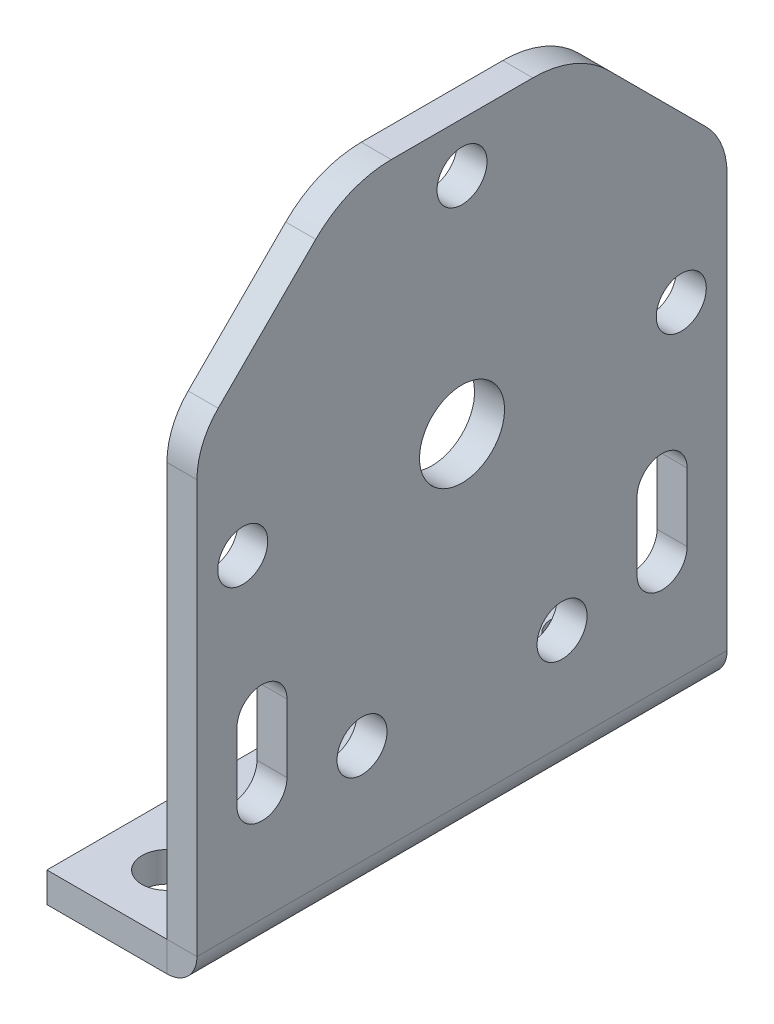
ISO-10303-21;
HEADER;
FILE_DESCRIPTION(('STEP AP214'),'2;1');
FILE_NAME('part.step','',(''),(''),'','','');
FILE_SCHEMA(('AUTOMOTIVE_DESIGN { 1 0 10303 214 1 1 1 1 }'));
ENDSEC;
DATA;
#1=APPLICATION_CONTEXT('core data for automotive mechanical design processes');
#2=APPLICATION_PROTOCOL_DEFINITION('international standard','automotive_design',2000,#1);
#3=PRODUCT_CONTEXT('',#1,'mechanical');
#4=PRODUCT('Part','Part','',(#3));
#5=PRODUCT_RELATED_PRODUCT_CATEGORY('part','',(#4));
#6=PRODUCT_DEFINITION_FORMATION('','',#4);
#7=PRODUCT_DEFINITION_CONTEXT('part definition',#1,'design');
#8=PRODUCT_DEFINITION('design','',#6,#7);
#9=PRODUCT_DEFINITION_SHAPE('','',#8);
#10=(LENGTH_UNIT() NAMED_UNIT(*) SI_UNIT(.MILLI.,.METRE.));
#11=(NAMED_UNIT(*) PLANE_ANGLE_UNIT() SI_UNIT($,.RADIAN.));
#12=(NAMED_UNIT(*) SI_UNIT($,.STERADIAN.) SOLID_ANGLE_UNIT());
#13=UNCERTAINTY_MEASURE_WITH_UNIT(LENGTH_MEASURE(1.E-05),#10,'distance_accuracy_value','');
#14=(GEOMETRIC_REPRESENTATION_CONTEXT(3) GLOBAL_UNCERTAINTY_ASSIGNED_CONTEXT((#13)) GLOBAL_UNIT_ASSIGNED_CONTEXT((#10,
#11,#12)) REPRESENTATION_CONTEXT('',''));
#15=CARTESIAN_POINT('',(0.,0.,0.));
#16=DIRECTION('',(0.,0.,1.));
#17=DIRECTION('',(1.,0.,0.));
#18=AXIS2_PLACEMENT_3D('',#15,#16,#17);
#19=CARTESIAN_POINT('',(12.,0.,0.));
#20=DIRECTION('',(0.,0.,-1.));
#21=DIRECTION('',(-1.,0.,0.));
#22=AXIS2_PLACEMENT_3D('',#19,#20,#21);
#23=PLANE('',#22);
#24=DIRECTION('',(0.,1.,0.));
#25=VECTOR('',#24,1.);
#26=CARTESIAN_POINT('',(12.,0.,0.));
#27=LINE('',#26,#25);
#28=CARTESIAN_POINT('',(12.,0.,0.));
#29=VERTEX_POINT('',#28);
#30=CARTESIAN_POINT('',(12.,41.2869516727951,0.));
#31=VERTEX_POINT('',#30);
#32=EDGE_CURVE('E324',#29,#31,#27,.T.);
#33=ORIENTED_EDGE('',*,*,#32,.T.);
#34=DIRECTION('',(-1.,0.,0.));
#35=VECTOR('',#34,1.);
#36=CARTESIAN_POINT('',(12.,41.2869516727951,0.));
#37=LINE('',#36,#35);
#38=CARTESIAN_POINT('',(15.,41.2869516727951,0.));
#39=VERTEX_POINT('',#38);
#40=EDGE_CURVE('E399',#31,#39,#37,.F.);
#41=ORIENTED_EDGE('',*,*,#40,.T.);
#42=DIRECTION('',(0.,1.,0.));
#43=VECTOR('',#42,1.);
#44=CARTESIAN_POINT('',(15.,0.,0.));
#45=LINE('',#44,#43);
#46=CARTESIAN_POINT('',(15.,0.,0.));
#47=VERTEX_POINT('',#46);
#48=EDGE_CURVE('E305',#47,#39,#45,.T.);
#49=ORIENTED_EDGE('',*,*,#48,.F.);
#50=DIRECTION('',(1.,0.,0.));
#51=VECTOR('',#50,1.);
#52=CARTESIAN_POINT('',(12.,0.,0.));
#53=LINE('',#52,#51);
#54=EDGE_CURVE('E365',#29,#47,#53,.T.);
#55=ORIENTED_EDGE('',*,*,#54,.F.);
#56=EDGE_LOOP('',(#33,#41,#49,#55));
#57=FACE_BOUND('',#56,.T.);
#58=ADVANCED_FACE('F42',(#57),#23,.T.);
#59=CARTESIAN_POINT('',(12.,0.,0.));
#60=DIRECTION('',(0.,0.,-1.));
#61=DIRECTION('',(-1.,0.,0.));
#62=AXIS2_PLACEMENT_3D('',#59,#60,#61);
#63=PLANE('',#62);
#64=DIRECTION('',(0.,-1.,0.));
#65=VECTOR('',#64,1.);
#66=CARTESIAN_POINT('',(12.,0.,0.));
#67=LINE('',#66,#65);
#68=CARTESIAN_POINT('',(12.,-3.,0.));
#69=VERTEX_POINT('',#68);
#70=EDGE_CURVE('E363',#29,#69,#67,.T.);
#71=ORIENTED_EDGE('',*,*,#70,.F.);
#72=ORIENTED_EDGE('',*,*,#54,.T.);
#73=CARTESIAN_POINT('',(12.,0.,0.));
#74=DIRECTION('',(0.,0.,-1.));
#75=DIRECTION('',(-1.,0.,0.));
#76=AXIS2_PLACEMENT_3D('',#73,#74,#75);
#77=CIRCLE('',#76,3.);
#78=EDGE_CURVE('E350',#47,#69,#77,.T.);
#79=ORIENTED_EDGE('',*,*,#78,.T.);
#80=EDGE_LOOP('',(#71,#72,#79));
#81=FACE_BOUND('',#80,.T.);
#82=ADVANCED_FACE('F472',(#81),#63,.T.);
#83=CARTESIAN_POINT('',(12.,0.,53.));
#84=DIRECTION('',(0.,0.,1.));
#85=DIRECTION('',(1.,0.,0.));
#86=AXIS2_PLACEMENT_3D('',#83,#84,#85);
#87=PLANE('',#86);
#88=DIRECTION('',(0.,-1.,0.));
#89=VECTOR('',#88,1.);
#90=CARTESIAN_POINT('',(12.,0.,53.));
#91=LINE('',#90,#89);
#92=CARTESIAN_POINT('',(12.,0.,53.));
#93=VERTEX_POINT('',#92);
#94=CARTESIAN_POINT('',(12.,-3.,53.));
#95=VERTEX_POINT('',#94);
#96=EDGE_CURVE('E361',#93,#95,#91,.T.);
#97=ORIENTED_EDGE('',*,*,#96,.F.);
#98=DIRECTION('',(1.,0.,0.));
#99=VECTOR('',#98,1.);
#100=CARTESIAN_POINT('',(0.,0.,53.));
#101=LINE('',#100,#99);
#102=CARTESIAN_POINT('',(0.,0.,53.));
#103=VERTEX_POINT('',#102);
#104=EDGE_CURVE('E312',#103,#93,#101,.T.);
#105=ORIENTED_EDGE('',*,*,#104,.F.);
#106=DIRECTION('',(0.,1.,0.));
#107=VECTOR('',#106,1.);
#108=CARTESIAN_POINT('',(0.,-3.,53.));
#109=LINE('',#108,#107);
#110=CARTESIAN_POINT('',(0.,-3.,53.));
#111=VERTEX_POINT('',#110);
#112=EDGE_CURVE('E315',#111,#103,#109,.T.);
#113=ORIENTED_EDGE('',*,*,#112,.F.);
#114=DIRECTION('',(1.,0.,0.));
#115=VECTOR('',#114,1.);
#116=CARTESIAN_POINT('',(0.,-3.,53.));
#117=LINE('',#116,#115);
#118=EDGE_CURVE('E318',#111,#95,#117,.T.);
#119=ORIENTED_EDGE('',*,*,#118,.T.);
#120=EDGE_LOOP('',(#97,#105,#113,#119));
#121=FACE_BOUND('',#120,.T.);
#122=ADVANCED_FACE('F424',(#121),#87,.T.);
#123=CARTESIAN_POINT('',(12.,0.,53.));
#124=DIRECTION('',(0.,0.,1.));
#125=DIRECTION('',(1.,0.,0.));
#126=AXIS2_PLACEMENT_3D('',#123,#124,#125);
#127=PLANE('',#126);
#128=DIRECTION('',(1.,0.,0.));
#129=VECTOR('',#128,1.);
#130=CARTESIAN_POINT('',(12.,0.,53.));
#131=LINE('',#130,#129);
#132=CARTESIAN_POINT('',(15.,0.,53.));
#133=VERTEX_POINT('',#132);
#134=EDGE_CURVE('E359',#93,#133,#131,.T.);
#135=ORIENTED_EDGE('',*,*,#134,.F.);
#136=ORIENTED_EDGE('',*,*,#96,.T.);
#137=CARTESIAN_POINT('',(12.,0.,53.));
#138=DIRECTION('',(0.,0.,-1.));
#139=DIRECTION('',(-1.,0.,0.));
#140=AXIS2_PLACEMENT_3D('',#137,#138,#139);
#141=CIRCLE('',#140,3.);
#142=EDGE_CURVE('E356',#95,#133,#141,.F.);
#143=ORIENTED_EDGE('',*,*,#142,.T.);
#144=EDGE_LOOP('',(#135,#136,#143));
#145=FACE_BOUND('',#144,.T.);
#146=ADVANCED_FACE('F440',(#145),#127,.T.);
#147=CARTESIAN_POINT('',(15.,0.,53.));
#148=DIRECTION('',(-1.,0.,0.));
#149=DIRECTION('',(0.,0.,1.));
#150=AXIS2_PLACEMENT_3D('',#147,#148,#149);
#151=PLANE('',#150);
#152=DIRECTION('',(0.,1.,0.));
#153=VECTOR('',#152,1.);
#154=CARTESIAN_POINT('',(15.,11.,49.));
#155=LINE('',#154,#153);
#156=CARTESIAN_POINT('',(15.,11.,49.));
#157=VERTEX_POINT('',#156);
#158=CARTESIAN_POINT('',(15.,17.8,49.));
#159=VERTEX_POINT('',#158);
#160=EDGE_CURVE('E196',#157,#159,#155,.T.);
#161=ORIENTED_EDGE('',*,*,#160,.T.);
#162=CARTESIAN_POINT('',(15.,17.8,46.5));
#163=DIRECTION('',(-1.,0.,0.));
#164=DIRECTION('',(0.,0.,1.));
#165=AXIS2_PLACEMENT_3D('',#162,#163,#164);
#166=CIRCLE('',#165,2.50000000000001);
#167=CARTESIAN_POINT('',(15.,17.8,44.));
#168=VERTEX_POINT('',#167);
#169=EDGE_CURVE('E188',#159,#168,#166,.T.);
#170=ORIENTED_EDGE('',*,*,#169,.T.);
#171=DIRECTION('',(0.,-1.,0.));
#172=VECTOR('',#171,1.);
#173=CARTESIAN_POINT('',(15.,17.8,44.));
#174=LINE('',#173,#172);
#175=CARTESIAN_POINT('',(15.,11.,44.));
#176=VERTEX_POINT('',#175);
#177=EDGE_CURVE('E200',#168,#176,#174,.T.);
#178=ORIENTED_EDGE('',*,*,#177,.T.);
#179=CARTESIAN_POINT('',(15.,11.,46.5));
#180=DIRECTION('',(-1.,0.,0.));
#181=DIRECTION('',(0.,0.,1.));
#182=AXIS2_PLACEMENT_3D('',#179,#180,#181);
#183=CIRCLE('',#182,2.5);
#184=EDGE_CURVE('E204',#176,#157,#183,.T.);
#185=ORIENTED_EDGE('',*,*,#184,.T.);
#186=EDGE_LOOP('',(#161,#170,#178,#185));
#187=FACE_BOUND('',#186,.T.);
#188=DIRECTION('',(0.,1.,0.));
#189=VECTOR('',#188,1.);
#190=CARTESIAN_POINT('',(15.,17.8,9.));
#191=LINE('',#190,#189);
#192=CARTESIAN_POINT('',(15.,11.,9.));
#193=VERTEX_POINT('',#192);
#194=CARTESIAN_POINT('',(15.,17.8,9.));
#195=VERTEX_POINT('',#194);
#196=EDGE_CURVE('E239',#193,#195,#191,.T.);
#197=ORIENTED_EDGE('',*,*,#196,.T.);
#198=CARTESIAN_POINT('',(15.,17.8,6.5));
#199=DIRECTION('',(-1.,0.,0.));
#200=DIRECTION('',(0.,0.,-1.));
#201=AXIS2_PLACEMENT_3D('',#198,#199,#200);
#202=CIRCLE('',#201,2.50000000000001);
#203=CARTESIAN_POINT('',(15.,17.8,3.99999999999999));
#204=VERTEX_POINT('',#203);
#205=EDGE_CURVE('E229',#195,#204,#202,.T.);
#206=ORIENTED_EDGE('',*,*,#205,.T.);
#207=DIRECTION('',(0.,-1.,0.));
#208=VECTOR('',#207,1.);
#209=CARTESIAN_POINT('',(15.,11.,4.));
#210=LINE('',#209,#208);
#211=CARTESIAN_POINT('',(15.,11.,4.));
#212=VERTEX_POINT('',#211);
#213=EDGE_CURVE('E232',#204,#212,#210,.T.);
#214=ORIENTED_EDGE('',*,*,#213,.T.);
#215=CARTESIAN_POINT('',(15.,11.,6.5));
#216=DIRECTION('',(-1.,0.,0.));
#217=DIRECTION('',(0.,0.,-1.));
#218=AXIS2_PLACEMENT_3D('',#215,#216,#217);
#219=CIRCLE('',#218,2.5);
#220=EDGE_CURVE('E236',#212,#193,#219,.T.);
#221=ORIENTED_EDGE('',*,*,#220,.T.);
#222=EDGE_LOOP('',(#197,#206,#214,#221));
#223=FACE_BOUND('',#222,.T.);
#224=CARTESIAN_POINT('',(15.,32.,26.5));
#225=DIRECTION('',(-1.,0.,0.));
#226=DIRECTION('',(0.,0.,1.));
#227=AXIS2_PLACEMENT_3D('',#224,#225,#226);
#228=CIRCLE('',#227,4.25000000000001);
#229=CARTESIAN_POINT('',(15.,32.,30.75));
#230=VERTEX_POINT('',#229);
#231=EDGE_CURVE('E246',#230,#230,#228,.T.);
#232=ORIENTED_EDGE('',*,*,#231,.T.);
#233=EDGE_LOOP('',(#232));
#234=FACE_BOUND('',#233,.T.);
#235=CARTESIAN_POINT('',(15.,54.35,26.5));
#236=DIRECTION('',(1.,0.,0.));
#237=DIRECTION('',(0.,0.,-1.));
#238=AXIS2_PLACEMENT_3D('',#235,#236,#237);
#239=CIRCLE('',#238,2.5);
#240=CARTESIAN_POINT('',(15.,54.35,24.));
#241=VERTEX_POINT('',#240);
#242=EDGE_CURVE('E275',#241,#241,#239,.T.);
#243=ORIENTED_EDGE('',*,*,#242,.F.);
#244=EDGE_LOOP('',(#243));
#245=FACE_BOUND('',#244,.T.);
#246=CARTESIAN_POINT('',(15.,32.43,48.42));
#247=DIRECTION('',(1.,0.,0.));
#248=DIRECTION('',(0.,0.,-1.));
#249=AXIS2_PLACEMENT_3D('',#246,#247,#248);
#250=CIRCLE('',#249,2.5);
#251=CARTESIAN_POINT('',(15.,32.43,45.92));
#252=VERTEX_POINT('',#251);
#253=EDGE_CURVE('E281',#252,#252,#250,.T.);
#254=ORIENTED_EDGE('',*,*,#253,.F.);
#255=EDGE_LOOP('',(#254));
#256=FACE_BOUND('',#255,.T.);
#257=CARTESIAN_POINT('',(15.,32.43,4.57999999999999));
#258=DIRECTION('',(1.,0.,0.));
#259=DIRECTION('',(0.,0.,-1.));
#260=AXIS2_PLACEMENT_3D('',#257,#258,#259);
#261=CIRCLE('',#260,2.5);
#262=CARTESIAN_POINT('',(15.,32.43,2.07999999999999));
#263=VERTEX_POINT('',#262);
#264=EDGE_CURVE('E287',#263,#263,#261,.T.);
#265=ORIENTED_EDGE('',*,*,#264,.F.);
#266=EDGE_LOOP('',(#265));
#267=FACE_BOUND('',#266,.T.);
#268=CARTESIAN_POINT('',(15.,10.,36.5));
#269=DIRECTION('',(1.,0.,0.));
#270=DIRECTION('',(0.,0.,-1.));
#271=AXIS2_PLACEMENT_3D('',#268,#269,#270);
#272=CIRCLE('',#271,2.5);
#273=CARTESIAN_POINT('',(15.,10.,34.));
#274=VERTEX_POINT('',#273);
#275=EDGE_CURVE('E293',#274,#274,#272,.T.);
#276=ORIENTED_EDGE('',*,*,#275,.F.);
#277=EDGE_LOOP('',(#276));
#278=FACE_BOUND('',#277,.T.);
#279=CARTESIAN_POINT('',(15.,10.,16.5));
#280=DIRECTION('',(1.,0.,0.));
#281=DIRECTION('',(0.,0.,-1.));
#282=AXIS2_PLACEMENT_3D('',#279,#280,#281);
#283=CIRCLE('',#282,2.5);
#284=CARTESIAN_POINT('',(15.,10.,14.));
#285=VERTEX_POINT('',#284);
#286=EDGE_CURVE('E299',#285,#285,#283,.T.);
#287=ORIENTED_EDGE('',*,*,#286,.F.);
#288=EDGE_LOOP('',(#287));
#289=FACE_BOUND('',#288,.T.);
#290=ORIENTED_EDGE('',*,*,#48,.T.);
#291=CARTESIAN_POINT('',(15.,41.2869516727951,7.25));
#292=DIRECTION('',(-1.,0.,0.));
#293=DIRECTION('',(0.,0.,1.));
#294=AXIS2_PLACEMENT_3D('',#291,#292,#293);
#295=CIRCLE('',#294,7.25);
#296=CARTESIAN_POINT('',(15.,46.4134758363975,2.12347583639754));
#297=VERTEX_POINT('',#296);
#298=EDGE_CURVE('E404',#39,#297,#295,.F.);
#299=ORIENTED_EDGE('',*,*,#298,.T.);
#300=DIRECTION('',(0.,-0.707106781186546,-0.707106781186549));
#301=VECTOR('',#300,1.);
#302=CARTESIAN_POINT('',(15.,44.29,0.));
#303=LINE('',#302,#301);
#304=CARTESIAN_POINT('',(15.,56.1619004230723,11.8719004230724));
#305=VERTEX_POINT('',#304);
#306=EDGE_CURVE('E367',#297,#305,#303,.F.);
#307=ORIENTED_EDGE('',*,*,#306,.T.);
#308=CARTESIAN_POINT('',(15.,48.61,19.4238008461447));
#309=DIRECTION('',(-1.,0.,0.));
#310=DIRECTION('',(0.,0.,1.));
#311=AXIS2_PLACEMENT_3D('',#308,#309,#310);
#312=CIRCLE('',#311,10.68);
#313=CARTESIAN_POINT('',(15.,59.29,19.4238008461447));
#314=VERTEX_POINT('',#313);
#315=EDGE_CURVE('E394',#305,#314,#312,.F.);
#316=ORIENTED_EDGE('',*,*,#315,.T.);
#317=DIRECTION('',(0.,0.,-1.));
#318=VECTOR('',#317,1.);
#319=CARTESIAN_POINT('',(15.,59.29,53.));
#320=LINE('',#319,#318);
#321=CARTESIAN_POINT('',(15.,59.29,33.5761991538554));
#322=VERTEX_POINT('',#321);
#323=EDGE_CURVE('E344',#322,#314,#320,.T.);
#324=ORIENTED_EDGE('',*,*,#323,.F.);
#325=CARTESIAN_POINT('',(15.,48.61,33.5761991538554));
#326=DIRECTION('',(-1.,0.,0.));
#327=DIRECTION('',(0.,0.,1.));
#328=AXIS2_PLACEMENT_3D('',#325,#326,#327);
#329=CIRCLE('',#328,10.68);
#330=CARTESIAN_POINT('',(15.,56.1619004230723,41.1280995769277));
#331=VERTEX_POINT('',#330);
#332=EDGE_CURVE('E392',#322,#331,#329,.F.);
#333=ORIENTED_EDGE('',*,*,#332,.T.);
#334=DIRECTION('',(0.,-0.707106781186549,0.707106781186546));
#335=VECTOR('',#334,1.);
#336=CARTESIAN_POINT('',(15.,59.29,38.));
#337=LINE('',#336,#335);
#338=CARTESIAN_POINT('',(15.,46.4134758363975,50.8765241636025));
#339=VERTEX_POINT('',#338);
#340=EDGE_CURVE('E371',#331,#339,#337,.T.);
#341=ORIENTED_EDGE('',*,*,#340,.T.);
#342=CARTESIAN_POINT('',(15.,41.286951672795,45.75));
#343=DIRECTION('',(-1.,0.,0.));
#344=DIRECTION('',(0.,0.,1.));
#345=AXIS2_PLACEMENT_3D('',#342,#343,#344);
#346=CIRCLE('',#345,7.25);
#347=CARTESIAN_POINT('',(15.,41.286951672795,53.));
#348=VERTEX_POINT('',#347);
#349=EDGE_CURVE('E402',#339,#348,#346,.F.);
#350=ORIENTED_EDGE('',*,*,#349,.T.);
#351=DIRECTION('',(0.,1.,0.));
#352=VECTOR('',#351,1.);
#353=CARTESIAN_POINT('',(15.,0.,53.));
#354=LINE('',#353,#352);
#355=EDGE_CURVE('E306',#133,#348,#354,.T.);
#356=ORIENTED_EDGE('',*,*,#355,.F.);
#357=DIRECTION('',(0.,0.,-1.));
#358=VECTOR('',#357,1.);
#359=CARTESIAN_POINT('',(15.,0.,53.));
#360=LINE('',#359,#358);
#361=EDGE_CURVE('E347',#133,#47,#360,.T.);
#362=ORIENTED_EDGE('',*,*,#361,.T.);
#363=EDGE_LOOP('',(#290,#299,#307,#316,#324,#333,#341,#350,#356,#362));
#364=FACE_BOUND('',#363,.T.);
#365=ADVANCED_FACE('F206',(#187,#223,#234,#245,#256,#267,#278,#289,#364),#151,.F.);
#366=CARTESIAN_POINT('',(12.,59.29,53.));
#367=DIRECTION('',(0.,1.,0.));
#368=DIRECTION('',(0.,0.,1.));
#369=AXIS2_PLACEMENT_3D('',#366,#367,#368);
#370=PLANE('',#369);
#371=ORIENTED_EDGE('',*,*,#323,.T.);
#372=DIRECTION('',(1.,0.,0.));
#373=VECTOR('',#372,1.);
#374=CARTESIAN_POINT('',(12.,59.29,19.4238008461447));
#375=LINE('',#374,#373);
#376=CARTESIAN_POINT('',(12.,59.29,19.4238008461447));
#377=VERTEX_POINT('',#376);
#378=EDGE_CURVE('E382',#314,#377,#375,.F.);
#379=ORIENTED_EDGE('',*,*,#378,.T.);
#380=DIRECTION('',(0.,0.,-1.));
#381=VECTOR('',#380,1.);
#382=CARTESIAN_POINT('',(12.,59.29,53.));
#383=LINE('',#382,#381);
#384=CARTESIAN_POINT('',(12.,59.29,33.5761991538554));
#385=VERTEX_POINT('',#384);
#386=EDGE_CURVE('E341',#385,#377,#383,.T.);
#387=ORIENTED_EDGE('',*,*,#386,.F.);
#388=DIRECTION('',(1.,0.,0.));
#389=VECTOR('',#388,1.);
#390=CARTESIAN_POINT('',(12.,59.29,33.5761991538554));
#391=LINE('',#390,#389);
#392=EDGE_CURVE('E379',#385,#322,#391,.T.);
#393=ORIENTED_EDGE('',*,*,#392,.T.);
#394=EDGE_LOOP('',(#371,#379,#387,#393));
#395=FACE_BOUND('',#394,.T.);
#396=ADVANCED_FACE('F452',(#395),#370,.T.);
#397=CARTESIAN_POINT('',(12.,0.,53.));
#398=DIRECTION('',(-1.,0.,0.));
#399=DIRECTION('',(0.,0.,1.));
#400=AXIS2_PLACEMENT_3D('',#397,#398,#399);
#401=PLANE('',#400);
#402=CARTESIAN_POINT('',(12.,17.8,46.5));
#403=DIRECTION('',(-1.,0.,0.));
#404=DIRECTION('',(0.,0.,1.));
#405=AXIS2_PLACEMENT_3D('',#402,#403,#404);
#406=CIRCLE('',#405,2.50000000000001);
#407=CARTESIAN_POINT('',(12.,17.8,49.));
#408=VERTEX_POINT('',#407);
#409=CARTESIAN_POINT('',(12.,17.8,44.));
#410=VERTEX_POINT('',#409);
#411=EDGE_CURVE('E191',#408,#410,#406,.T.);
#412=ORIENTED_EDGE('',*,*,#411,.F.);
#413=DIRECTION('',(0.,1.,0.));
#414=VECTOR('',#413,1.);
#415=CARTESIAN_POINT('',(12.,11.,49.));
#416=LINE('',#415,#414);
#417=CARTESIAN_POINT('',(12.,11.,49.));
#418=VERTEX_POINT('',#417);
#419=EDGE_CURVE('E209',#418,#408,#416,.T.);
#420=ORIENTED_EDGE('',*,*,#419,.F.);
#421=CARTESIAN_POINT('',(12.,11.,46.5));
#422=DIRECTION('',(-1.,0.,0.));
#423=DIRECTION('',(0.,0.,1.));
#424=AXIS2_PLACEMENT_3D('',#421,#422,#423);
#425=CIRCLE('',#424,2.5);
#426=CARTESIAN_POINT('',(12.,11.,44.));
#427=VERTEX_POINT('',#426);
#428=EDGE_CURVE('E212',#427,#418,#425,.T.);
#429=ORIENTED_EDGE('',*,*,#428,.F.);
#430=DIRECTION('',(0.,-1.,0.));
#431=VECTOR('',#430,1.);
#432=CARTESIAN_POINT('',(12.,17.8,44.));
#433=LINE('',#432,#431);
#434=EDGE_CURVE('E218',#410,#427,#433,.T.);
#435=ORIENTED_EDGE('',*,*,#434,.F.);
#436=EDGE_LOOP('',(#412,#420,#429,#435));
#437=FACE_BOUND('',#436,.T.);
#438=CARTESIAN_POINT('',(12.,17.8,6.5));
#439=DIRECTION('',(-1.,0.,0.));
#440=DIRECTION('',(0.,0.,-1.));
#441=AXIS2_PLACEMENT_3D('',#438,#439,#440);
#442=CIRCLE('',#441,2.50000000000001);
#443=CARTESIAN_POINT('',(12.,17.8,9.));
#444=VERTEX_POINT('',#443);
#445=CARTESIAN_POINT('',(12.,17.8,3.99999999999999));
#446=VERTEX_POINT('',#445);
#447=EDGE_CURVE('E243',#444,#446,#442,.T.);
#448=ORIENTED_EDGE('',*,*,#447,.F.);
#449=DIRECTION('',(0.,1.,0.));
#450=VECTOR('',#449,1.);
#451=CARTESIAN_POINT('',(12.,17.8,9.));
#452=LINE('',#451,#450);
#453=CARTESIAN_POINT('',(12.,11.,9.));
#454=VERTEX_POINT('',#453);
#455=EDGE_CURVE('E233',#454,#444,#452,.T.);
#456=ORIENTED_EDGE('',*,*,#455,.F.);
#457=CARTESIAN_POINT('',(12.,11.,6.5));
#458=DIRECTION('',(-1.,0.,0.));
#459=DIRECTION('',(0.,0.,-1.));
#460=AXIS2_PLACEMENT_3D('',#457,#458,#459);
#461=CIRCLE('',#460,2.5);
#462=CARTESIAN_POINT('',(12.,11.,4.));
#463=VERTEX_POINT('',#462);
#464=EDGE_CURVE('E249',#463,#454,#461,.T.);
#465=ORIENTED_EDGE('',*,*,#464,.F.);
#466=DIRECTION('',(0.,-1.,0.));
#467=VECTOR('',#466,1.);
#468=CARTESIAN_POINT('',(12.,11.,4.));
#469=LINE('',#468,#467);
#470=EDGE_CURVE('E245',#446,#463,#469,.T.);
#471=ORIENTED_EDGE('',*,*,#470,.F.);
#472=EDGE_LOOP('',(#448,#456,#465,#471));
#473=FACE_BOUND('',#472,.T.);
#474=CARTESIAN_POINT('',(12.,32.,26.5));
#475=DIRECTION('',(-1.,0.,0.));
#476=DIRECTION('',(0.,0.,1.));
#477=AXIS2_PLACEMENT_3D('',#474,#475,#476);
#478=CIRCLE('',#477,4.25000000000001);
#479=CARTESIAN_POINT('',(12.,32.,30.75));
#480=VERTEX_POINT('',#479);
#481=EDGE_CURVE('E263',#480,#480,#478,.T.);
#482=ORIENTED_EDGE('',*,*,#481,.F.);
#483=EDGE_LOOP('',(#482));
#484=FACE_BOUND('',#483,.T.);
#485=CARTESIAN_POINT('',(12.,54.35,26.5));
#486=DIRECTION('',(1.,0.,0.));
#487=DIRECTION('',(0.,0.,-1.));
#488=AXIS2_PLACEMENT_3D('',#485,#486,#487);
#489=CIRCLE('',#488,2.5);
#490=CARTESIAN_POINT('',(12.,54.35,24.));
#491=VERTEX_POINT('',#490);
#492=EDGE_CURVE('E278',#491,#491,#489,.T.);
#493=ORIENTED_EDGE('',*,*,#492,.T.);
#494=EDGE_LOOP('',(#493));
#495=FACE_BOUND('',#494,.T.);
#496=CARTESIAN_POINT('',(12.,32.43,48.42));
#497=DIRECTION('',(1.,0.,0.));
#498=DIRECTION('',(0.,0.,-1.));
#499=AXIS2_PLACEMENT_3D('',#496,#497,#498);
#500=CIRCLE('',#499,2.5);
#501=CARTESIAN_POINT('',(12.,32.43,45.92));
#502=VERTEX_POINT('',#501);
#503=EDGE_CURVE('E284',#502,#502,#500,.T.);
#504=ORIENTED_EDGE('',*,*,#503,.T.);
#505=EDGE_LOOP('',(#504));
#506=FACE_BOUND('',#505,.T.);
#507=CARTESIAN_POINT('',(12.,32.43,4.57999999999999));
#508=DIRECTION('',(1.,0.,0.));
#509=DIRECTION('',(0.,0.,-1.));
#510=AXIS2_PLACEMENT_3D('',#507,#508,#509);
#511=CIRCLE('',#510,2.5);
#512=CARTESIAN_POINT('',(12.,32.43,2.07999999999999));
#513=VERTEX_POINT('',#512);
#514=EDGE_CURVE('E290',#513,#513,#511,.T.);
#515=ORIENTED_EDGE('',*,*,#514,.T.);
#516=EDGE_LOOP('',(#515));
#517=FACE_BOUND('',#516,.T.);
#518=CARTESIAN_POINT('',(12.,10.,36.5));
#519=DIRECTION('',(1.,0.,0.));
#520=DIRECTION('',(0.,0.,-1.));
#521=AXIS2_PLACEMENT_3D('',#518,#519,#520);
#522=CIRCLE('',#521,2.5);
#523=CARTESIAN_POINT('',(12.,10.,34.));
#524=VERTEX_POINT('',#523);
#525=EDGE_CURVE('E296',#524,#524,#522,.T.);
#526=ORIENTED_EDGE('',*,*,#525,.T.);
#527=EDGE_LOOP('',(#526));
#528=FACE_BOUND('',#527,.T.);
#529=CARTESIAN_POINT('',(12.,10.,16.5));
#530=DIRECTION('',(1.,0.,0.));
#531=DIRECTION('',(0.,0.,-1.));
#532=AXIS2_PLACEMENT_3D('',#529,#530,#531);
#533=CIRCLE('',#532,2.5);
#534=CARTESIAN_POINT('',(12.,10.,14.));
#535=VERTEX_POINT('',#534);
#536=EDGE_CURVE('E302',#535,#535,#533,.T.);
#537=ORIENTED_EDGE('',*,*,#536,.T.);
#538=EDGE_LOOP('',(#537));
#539=FACE_BOUND('',#538,.T.);
#540=DIRECTION('',(0.,0.707106781186546,0.707106781186549));
#541=VECTOR('',#540,1.);
#542=CARTESIAN_POINT('',(12.,48.6450000000001,4.35500000000009));
#543=LINE('',#542,#541);
#544=CARTESIAN_POINT('',(12.,56.1619004230724,11.8719004230724));
#545=VERTEX_POINT('',#544);
#546=CARTESIAN_POINT('',(12.,46.4134758363976,2.12347583639753));
#547=VERTEX_POINT('',#546);
#548=EDGE_CURVE('E374',#545,#547,#543,.F.);
#549=ORIENTED_EDGE('',*,*,#548,.T.);
#550=CARTESIAN_POINT('',(12.,41.2869516727951,7.25));
#551=DIRECTION('',(-1.,0.,0.));
#552=DIRECTION('',(0.,0.,1.));
#553=AXIS2_PLACEMENT_3D('',#550,#551,#552);
#554=CIRCLE('',#553,7.25);
#555=EDGE_CURVE('E409',#547,#31,#554,.T.);
#556=ORIENTED_EDGE('',*,*,#555,.T.);
#557=ORIENTED_EDGE('',*,*,#32,.F.);
#558=DIRECTION('',(0.,0.,-1.));
#559=VECTOR('',#558,1.);
#560=CARTESIAN_POINT('',(12.,0.,53.));
#561=LINE('',#560,#559);
#562=EDGE_CURVE('E338',#93,#29,#561,.T.);
#563=ORIENTED_EDGE('',*,*,#562,.F.);
#564=DIRECTION('',(0.,1.,0.));
#565=VECTOR('',#564,1.);
#566=CARTESIAN_POINT('',(12.,0.,53.));
#567=LINE('',#566,#565);
#568=CARTESIAN_POINT('',(12.,41.286951672795,53.));
#569=VERTEX_POINT('',#568);
#570=EDGE_CURVE('E309',#93,#569,#567,.T.);
#571=ORIENTED_EDGE('',*,*,#570,.T.);
#572=CARTESIAN_POINT('',(12.,41.286951672795,45.75));
#573=DIRECTION('',(-1.,0.,0.));
#574=DIRECTION('',(0.,0.,1.));
#575=AXIS2_PLACEMENT_3D('',#572,#573,#574);
#576=CIRCLE('',#575,7.25);
#577=CARTESIAN_POINT('',(12.,46.4134758363975,50.8765241636025));
#578=VERTEX_POINT('',#577);
#579=EDGE_CURVE('E57',#569,#578,#576,.T.);
#580=ORIENTED_EDGE('',*,*,#579,.T.);
#581=DIRECTION('',(0.,0.707106781186549,-0.707106781186546));
#582=VECTOR('',#581,1.);
#583=CARTESIAN_POINT('',(12.,22.1449999999999,75.145));
#584=LINE('',#583,#582);
#585=CARTESIAN_POINT('',(12.,56.1619004230723,41.1280995769277));
#586=VERTEX_POINT('',#585);
#587=EDGE_CURVE('E377',#578,#586,#584,.T.);
#588=ORIENTED_EDGE('',*,*,#587,.T.);
#589=CARTESIAN_POINT('',(12.,48.61,33.5761991538554));
#590=DIRECTION('',(-1.,0.,0.));
#591=DIRECTION('',(0.,0.,1.));
#592=AXIS2_PLACEMENT_3D('',#589,#590,#591);
#593=CIRCLE('',#592,10.68);
#594=EDGE_CURVE('E385',#586,#385,#593,.T.);
#595=ORIENTED_EDGE('',*,*,#594,.T.);
#596=ORIENTED_EDGE('',*,*,#386,.T.);
#597=CARTESIAN_POINT('',(12.,48.61,19.4238008461447));
#598=DIRECTION('',(-1.,0.,0.));
#599=DIRECTION('',(0.,0.,1.));
#600=AXIS2_PLACEMENT_3D('',#597,#598,#599);
#601=CIRCLE('',#600,10.68);
#602=EDGE_CURVE('E387',#377,#545,#601,.T.);
#603=ORIENTED_EDGE('',*,*,#602,.T.);
#604=EDGE_LOOP('',(#549,#556,#557,#563,#571,#580,#588,#595,#596,#603));
#605=FACE_BOUND('',#604,.T.);
#606=ADVANCED_FACE('F416',(#437,#473,#484,#495,#506,#517,#528,#539,#605),#401,.T.);
#607=CARTESIAN_POINT('',(0.,0.,53.));
#608=DIRECTION('',(0.,1.,0.));
#609=DIRECTION('',(0.,0.,1.));
#610=AXIS2_PLACEMENT_3D('',#607,#608,#609);
#611=PLANE('',#610);
#612=CARTESIAN_POINT('',(5.99999999999999,0.,6.));
#613=DIRECTION('',(0.,1.,0.));
#614=DIRECTION('',(0.,0.,1.));
#615=AXIS2_PLACEMENT_3D('',#612,#613,#614);
#616=CIRCLE('',#615,2.49999999999999);
#617=CARTESIAN_POINT('',(5.99999999999999,0.,8.49999999999999));
#618=VERTEX_POINT('',#617);
#619=EDGE_CURVE('E225',#618,#618,#616,.T.);
#620=ORIENTED_EDGE('',*,*,#619,.F.);
#621=EDGE_LOOP('',(#620));
#622=FACE_BOUND('',#621,.T.);
#623=CARTESIAN_POINT('',(6.,0.,47.));
#624=DIRECTION('',(0.,1.,0.));
#625=DIRECTION('',(0.,0.,1.));
#626=AXIS2_PLACEMENT_3D('',#623,#624,#625);
#627=CIRCLE('',#626,2.49999999999999);
#628=CARTESIAN_POINT('',(6.,0.,49.5));
#629=VERTEX_POINT('',#628);
#630=EDGE_CURVE('E269',#629,#629,#627,.T.);
#631=ORIENTED_EDGE('',*,*,#630,.F.);
#632=EDGE_LOOP('',(#631));
#633=FACE_BOUND('',#632,.T.);
#634=DIRECTION('',(1.,0.,0.));
#635=VECTOR('',#634,1.);
#636=CARTESIAN_POINT('',(0.,0.,0.));
#637=LINE('',#636,#635);
#638=CARTESIAN_POINT('',(0.,0.,0.));
#639=VERTEX_POINT('',#638);
#640=EDGE_CURVE('E327',#639,#29,#637,.T.);
#641=ORIENTED_EDGE('',*,*,#640,.F.);
#642=DIRECTION('',(0.,0.,-1.));
#643=VECTOR('',#642,1.);
#644=CARTESIAN_POINT('',(0.,0.,53.));
#645=LINE('',#644,#643);
#646=EDGE_CURVE('E336',#103,#639,#645,.T.);
#647=ORIENTED_EDGE('',*,*,#646,.F.);
#648=ORIENTED_EDGE('',*,*,#104,.T.);
#649=ORIENTED_EDGE('',*,*,#562,.T.);
#650=EDGE_LOOP('',(#641,#647,#648,#649));
#651=FACE_BOUND('',#650,.T.);
#652=ADVANCED_FACE('F420',(#622,#633,#651),#611,.T.);
#653=CARTESIAN_POINT('',(0.,-3.,53.));
#654=DIRECTION('',(-1.,0.,0.));
#655=DIRECTION('',(0.,0.,1.));
#656=AXIS2_PLACEMENT_3D('',#653,#654,#655);
#657=PLANE('',#656);
#658=DIRECTION('',(0.,1.,0.));
#659=VECTOR('',#658,1.);
#660=CARTESIAN_POINT('',(0.,-3.,0.));
#661=LINE('',#660,#659);
#662=CARTESIAN_POINT('',(0.,-3.,0.));
#663=VERTEX_POINT('',#662);
#664=EDGE_CURVE('E330',#663,#639,#661,.T.);
#665=ORIENTED_EDGE('',*,*,#664,.F.);
#666=DIRECTION('',(0.,0.,-1.));
#667=VECTOR('',#666,1.);
#668=CARTESIAN_POINT('',(0.,-3.,53.));
#669=LINE('',#668,#667);
#670=EDGE_CURVE('E321',#111,#663,#669,.T.);
#671=ORIENTED_EDGE('',*,*,#670,.F.);
#672=ORIENTED_EDGE('',*,*,#112,.T.);
#673=ORIENTED_EDGE('',*,*,#646,.T.);
#674=EDGE_LOOP('',(#665,#671,#672,#673));
#675=FACE_BOUND('',#674,.T.);
#676=ADVANCED_FACE('F428',(#675),#657,.T.);
#677=CARTESIAN_POINT('',(0.,-3.,53.));
#678=DIRECTION('',(0.,1.,0.));
#679=DIRECTION('',(0.,0.,1.));
#680=AXIS2_PLACEMENT_3D('',#677,#678,#679);
#681=PLANE('',#680);
#682=CARTESIAN_POINT('',(5.99999999999999,-3.,6.));
#683=DIRECTION('',(0.,1.,0.));
#684=DIRECTION('',(0.,0.,1.));
#685=AXIS2_PLACEMENT_3D('',#682,#683,#684);
#686=CIRCLE('',#685,2.49999999999999);
#687=CARTESIAN_POINT('',(5.99999999999999,-3.,8.49999999999999));
#688=VERTEX_POINT('',#687);
#689=EDGE_CURVE('E268',#688,#688,#686,.T.);
#690=ORIENTED_EDGE('',*,*,#689,.T.);
#691=EDGE_LOOP('',(#690));
#692=FACE_BOUND('',#691,.T.);
#693=CARTESIAN_POINT('',(6.,-3.,47.));
#694=DIRECTION('',(0.,1.,0.));
#695=DIRECTION('',(0.,0.,1.));
#696=AXIS2_PLACEMENT_3D('',#693,#694,#695);
#697=CIRCLE('',#696,2.49999999999999);
#698=CARTESIAN_POINT('',(6.,-3.,49.5));
#699=VERTEX_POINT('',#698);
#700=EDGE_CURVE('E272',#699,#699,#697,.T.);
#701=ORIENTED_EDGE('',*,*,#700,.T.);
#702=EDGE_LOOP('',(#701));
#703=FACE_BOUND('',#702,.T.);
#704=DIRECTION('',(1.,0.,0.));
#705=VECTOR('',#704,1.);
#706=CARTESIAN_POINT('',(0.,-3.,0.));
#707=LINE('',#706,#705);
#708=EDGE_CURVE('E310',#663,#69,#707,.T.);
#709=ORIENTED_EDGE('',*,*,#708,.T.);
#710=DIRECTION('',(0.,0.,-1.));
#711=VECTOR('',#710,1.);
#712=CARTESIAN_POINT('',(12.,-3.,53.));
#713=LINE('',#712,#711);
#714=EDGE_CURVE('E353',#69,#95,#713,.F.);
#715=ORIENTED_EDGE('',*,*,#714,.T.);
#716=ORIENTED_EDGE('',*,*,#118,.F.);
#717=ORIENTED_EDGE('',*,*,#670,.T.);
#718=EDGE_LOOP('',(#709,#715,#716,#717));
#719=FACE_BOUND('',#718,.T.);
#720=ADVANCED_FACE('F432',(#692,#703,#719),#681,.F.);
#721=CARTESIAN_POINT('',(0.,0.,53.));
#722=DIRECTION('',(0.,0.,-1.));
#723=DIRECTION('',(-1.,0.,0.));
#724=AXIS2_PLACEMENT_3D('',#721,#722,#723);
#725=PLANE('',#724);
#726=ORIENTED_EDGE('',*,*,#355,.T.);
#727=DIRECTION('',(-1.,0.,0.));
#728=VECTOR('',#727,1.);
#729=CARTESIAN_POINT('',(12.,41.286951672795,53.));
#730=LINE('',#729,#728);
#731=EDGE_CURVE('E50',#348,#569,#730,.T.);
#732=ORIENTED_EDGE('',*,*,#731,.T.);
#733=ORIENTED_EDGE('',*,*,#570,.F.);
#734=ORIENTED_EDGE('',*,*,#134,.T.);
#735=EDGE_LOOP('',(#726,#732,#733,#734));
#736=FACE_BOUND('',#735,.T.);
#737=ADVANCED_FACE('F412',(#736),#725,.F.);
#738=CARTESIAN_POINT('',(0.,0.,0.));
#739=DIRECTION('',(0.,0.,-1.));
#740=DIRECTION('',(-1.,0.,0.));
#741=AXIS2_PLACEMENT_3D('',#738,#739,#740);
#742=PLANE('',#741);
#743=ORIENTED_EDGE('',*,*,#640,.T.);
#744=ORIENTED_EDGE('',*,*,#70,.T.);
#745=ORIENTED_EDGE('',*,*,#708,.F.);
#746=ORIENTED_EDGE('',*,*,#664,.T.);
#747=EDGE_LOOP('',(#743,#744,#745,#746));
#748=FACE_BOUND('',#747,.T.);
#749=ADVANCED_FACE('F474',(#748),#742,.T.);
#750=CARTESIAN_POINT('',(12.,0.,53.));
#751=DIRECTION('',(0.,0.,-1.));
#752=DIRECTION('',(-1.,0.,0.));
#753=AXIS2_PLACEMENT_3D('',#750,#751,#752);
#754=CYLINDRICAL_SURFACE('',#753,3.);
#755=ORIENTED_EDGE('',*,*,#142,.F.);
#756=ORIENTED_EDGE('',*,*,#714,.F.);
#757=ORIENTED_EDGE('',*,*,#78,.F.);
#758=ORIENTED_EDGE('',*,*,#361,.F.);
#759=EDGE_LOOP('',(#755,#756,#757,#758));
#760=FACE_BOUND('',#759,.T.);
#761=ADVANCED_FACE('F437',(#760),#754,.T.);
#762=CARTESIAN_POINT('',(15.,10.,16.5));
#763=DIRECTION('',(1.,0.,0.));
#764=DIRECTION('',(0.,0.,-1.));
#765=AXIS2_PLACEMENT_3D('',#762,#763,#764);
#766=CYLINDRICAL_SURFACE('',#765,2.5);
#767=ORIENTED_EDGE('',*,*,#536,.F.);
#768=EDGE_LOOP('',(#767));
#769=FACE_BOUND('',#768,.T.);
#770=ORIENTED_EDGE('',*,*,#286,.T.);
#771=EDGE_LOOP('',(#770));
#772=FACE_BOUND('',#771,.T.);
#773=ADVANCED_FACE('F481',(#769,#772),#766,.F.);
#774=CARTESIAN_POINT('',(15.,10.,36.5));
#775=DIRECTION('',(1.,0.,0.));
#776=DIRECTION('',(0.,0.,-1.));
#777=AXIS2_PLACEMENT_3D('',#774,#775,#776);
#778=CYLINDRICAL_SURFACE('',#777,2.5);
#779=ORIENTED_EDGE('',*,*,#525,.F.);
#780=EDGE_LOOP('',(#779));
#781=FACE_BOUND('',#780,.T.);
#782=ORIENTED_EDGE('',*,*,#275,.T.);
#783=EDGE_LOOP('',(#782));
#784=FACE_BOUND('',#783,.T.);
#785=ADVANCED_FACE('F761',(#781,#784),#778,.F.);
#786=CARTESIAN_POINT('',(15.,32.43,4.57999999999999));
#787=DIRECTION('',(1.,0.,0.));
#788=DIRECTION('',(0.,0.,-1.));
#789=AXIS2_PLACEMENT_3D('',#786,#787,#788);
#790=CYLINDRICAL_SURFACE('',#789,2.5);
#791=ORIENTED_EDGE('',*,*,#514,.F.);
#792=EDGE_LOOP('',(#791));
#793=FACE_BOUND('',#792,.T.);
#794=ORIENTED_EDGE('',*,*,#264,.T.);
#795=EDGE_LOOP('',(#794));
#796=FACE_BOUND('',#795,.T.);
#797=ADVANCED_FACE('F749',(#793,#796),#790,.F.);
#798=CARTESIAN_POINT('',(15.,32.43,48.42));
#799=DIRECTION('',(1.,0.,0.));
#800=DIRECTION('',(0.,0.,-1.));
#801=AXIS2_PLACEMENT_3D('',#798,#799,#800);
#802=CYLINDRICAL_SURFACE('',#801,2.5);
#803=ORIENTED_EDGE('',*,*,#503,.F.);
#804=EDGE_LOOP('',(#803));
#805=FACE_BOUND('',#804,.T.);
#806=ORIENTED_EDGE('',*,*,#253,.T.);
#807=EDGE_LOOP('',(#806));
#808=FACE_BOUND('',#807,.T.);
#809=ADVANCED_FACE('F737',(#805,#808),#802,.F.);
#810=CARTESIAN_POINT('',(15.,54.35,26.5));
#811=DIRECTION('',(1.,0.,0.));
#812=DIRECTION('',(0.,0.,-1.));
#813=AXIS2_PLACEMENT_3D('',#810,#811,#812);
#814=CYLINDRICAL_SURFACE('',#813,2.5);
#815=ORIENTED_EDGE('',*,*,#492,.F.);
#816=EDGE_LOOP('',(#815));
#817=FACE_BOUND('',#816,.T.);
#818=ORIENTED_EDGE('',*,*,#242,.T.);
#819=EDGE_LOOP('',(#818));
#820=FACE_BOUND('',#819,.T.);
#821=ADVANCED_FACE('F706',(#817,#820),#814,.F.);
#822=CARTESIAN_POINT('',(6.,0.,47.));
#823=DIRECTION('',(0.,1.,0.));
#824=DIRECTION('',(0.,0.,1.));
#825=AXIS2_PLACEMENT_3D('',#822,#823,#824);
#826=CYLINDRICAL_SURFACE('',#825,2.49999999999999);
#827=ORIENTED_EDGE('',*,*,#630,.T.);
#828=EDGE_LOOP('',(#827));
#829=FACE_BOUND('',#828,.T.);
#830=ORIENTED_EDGE('',*,*,#700,.F.);
#831=EDGE_LOOP('',(#830));
#832=FACE_BOUND('',#831,.T.);
#833=ADVANCED_FACE('F694',(#829,#832),#826,.F.);
#834=CARTESIAN_POINT('',(5.99999999999999,0.,6.));
#835=DIRECTION('',(0.,1.,0.));
#836=DIRECTION('',(0.,0.,1.));
#837=AXIS2_PLACEMENT_3D('',#834,#835,#836);
#838=CYLINDRICAL_SURFACE('',#837,2.49999999999999);
#839=ORIENTED_EDGE('',*,*,#619,.T.);
#840=EDGE_LOOP('',(#839));
#841=FACE_BOUND('',#840,.T.);
#842=ORIENTED_EDGE('',*,*,#689,.F.);
#843=EDGE_LOOP('',(#842));
#844=FACE_BOUND('',#843,.T.);
#845=ADVANCED_FACE('F682',(#841,#844),#838,.F.);
#846=CARTESIAN_POINT('',(15.,32.,26.5));
#847=DIRECTION('',(-1.,0.,0.));
#848=DIRECTION('',(0.,0.,1.));
#849=AXIS2_PLACEMENT_3D('',#846,#847,#848);
#850=CYLINDRICAL_SURFACE('',#849,4.25000000000001);
#851=ORIENTED_EDGE('',*,*,#231,.F.);
#852=EDGE_LOOP('',(#851));
#853=FACE_BOUND('',#852,.T.);
#854=ORIENTED_EDGE('',*,*,#481,.T.);
#855=EDGE_LOOP('',(#854));
#856=FACE_BOUND('',#855,.T.);
#857=ADVANCED_FACE('F671',(#853,#856),#850,.F.);
#858=CARTESIAN_POINT('',(15.,17.8,6.5));
#859=DIRECTION('',(-1.,0.,0.));
#860=DIRECTION('',(0.,0.,1.));
#861=AXIS2_PLACEMENT_3D('',#858,#859,#860);
#862=CYLINDRICAL_SURFACE('',#861,2.50000000000001);
#863=ORIENTED_EDGE('',*,*,#447,.T.);
#864=DIRECTION('',(-1.,0.,0.));
#865=VECTOR('',#864,1.);
#866=CARTESIAN_POINT('',(15.,17.8,3.99999999999999));
#867=LINE('',#866,#865);
#868=EDGE_CURVE('E242',#204,#446,#867,.T.);
#869=ORIENTED_EDGE('',*,*,#868,.F.);
#870=ORIENTED_EDGE('',*,*,#205,.F.);
#871=DIRECTION('',(-1.,0.,0.));
#872=VECTOR('',#871,1.);
#873=CARTESIAN_POINT('',(15.,17.8,9.));
#874=LINE('',#873,#872);
#875=EDGE_CURVE('E219',#195,#444,#874,.T.);
#876=ORIENTED_EDGE('',*,*,#875,.T.);
#877=EDGE_LOOP('',(#863,#869,#870,#876));
#878=FACE_BOUND('',#877,.T.);
#879=ADVANCED_FACE('F660',(#878),#862,.F.);
#880=CARTESIAN_POINT('',(15.,17.8,9.));
#881=DIRECTION('',(0.,0.,1.));
#882=DIRECTION('',(1.,0.,0.));
#883=AXIS2_PLACEMENT_3D('',#880,#881,#882);
#884=PLANE('',#883);
#885=ORIENTED_EDGE('',*,*,#455,.T.);
#886=ORIENTED_EDGE('',*,*,#875,.F.);
#887=ORIENTED_EDGE('',*,*,#196,.F.);
#888=DIRECTION('',(-1.,0.,0.));
#889=VECTOR('',#888,1.);
#890=CARTESIAN_POINT('',(15.,11.,9.));
#891=LINE('',#890,#889);
#892=EDGE_CURVE('E255',#193,#454,#891,.T.);
#893=ORIENTED_EDGE('',*,*,#892,.T.);
#894=EDGE_LOOP('',(#885,#886,#887,#893));
#895=FACE_BOUND('',#894,.T.);
#896=ADVANCED_FACE('F649',(#895),#884,.F.);
#897=CARTESIAN_POINT('',(15.,11.,6.5));
#898=DIRECTION('',(-1.,0.,0.));
#899=DIRECTION('',(0.,0.,1.));
#900=AXIS2_PLACEMENT_3D('',#897,#898,#899);
#901=CYLINDRICAL_SURFACE('',#900,2.5);
#902=ORIENTED_EDGE('',*,*,#464,.T.);
#903=ORIENTED_EDGE('',*,*,#892,.F.);
#904=ORIENTED_EDGE('',*,*,#220,.F.);
#905=DIRECTION('',(-1.,0.,0.));
#906=VECTOR('',#905,1.);
#907=CARTESIAN_POINT('',(15.,11.,4.));
#908=LINE('',#907,#906);
#909=EDGE_CURVE('E257',#212,#463,#908,.T.);
#910=ORIENTED_EDGE('',*,*,#909,.T.);
#911=EDGE_LOOP('',(#902,#903,#904,#910));
#912=FACE_BOUND('',#911,.T.);
#913=ADVANCED_FACE('F638',(#912),#901,.F.);
#914=CARTESIAN_POINT('',(15.,11.,4.));
#915=DIRECTION('',(0.,0.,-1.));
#916=DIRECTION('',(0.,1.,0.));
#917=AXIS2_PLACEMENT_3D('',#914,#915,#916);
#918=PLANE('',#917);
#919=ORIENTED_EDGE('',*,*,#470,.T.);
#920=ORIENTED_EDGE('',*,*,#909,.F.);
#921=ORIENTED_EDGE('',*,*,#213,.F.);
#922=ORIENTED_EDGE('',*,*,#868,.T.);
#923=EDGE_LOOP('',(#919,#920,#921,#922));
#924=FACE_BOUND('',#923,.T.);
#925=ADVANCED_FACE('F628',(#924),#918,.F.);
#926=CARTESIAN_POINT('',(15.,17.8,46.5));
#927=DIRECTION('',(-1.,0.,0.));
#928=DIRECTION('',(0.,0.,1.));
#929=AXIS2_PLACEMENT_3D('',#926,#927,#928);
#930=CYLINDRICAL_SURFACE('',#929,2.50000000000001);
#931=ORIENTED_EDGE('',*,*,#411,.T.);
#932=DIRECTION('',(-1.,0.,0.));
#933=VECTOR('',#932,1.);
#934=CARTESIAN_POINT('',(15.,17.8,44.));
#935=LINE('',#934,#933);
#936=EDGE_CURVE('E184',#168,#410,#935,.T.);
#937=ORIENTED_EDGE('',*,*,#936,.F.);
#938=ORIENTED_EDGE('',*,*,#169,.F.);
#939=DIRECTION('',(-1.,0.,0.));
#940=VECTOR('',#939,1.);
#941=CARTESIAN_POINT('',(15.,17.8,49.));
#942=LINE('',#941,#940);
#943=EDGE_CURVE('E223',#159,#408,#942,.T.);
#944=ORIENTED_EDGE('',*,*,#943,.T.);
#945=EDGE_LOOP('',(#931,#937,#938,#944));
#946=FACE_BOUND('',#945,.T.);
#947=ADVANCED_FACE('F186',(#946),#930,.F.);
#948=CARTESIAN_POINT('',(15.,11.,49.));
#949=DIRECTION('',(0.,0.,1.));
#950=DIRECTION('',(0.,-1.,0.));
#951=AXIS2_PLACEMENT_3D('',#948,#949,#950);
#952=PLANE('',#951);
#953=ORIENTED_EDGE('',*,*,#419,.T.);
#954=ORIENTED_EDGE('',*,*,#943,.F.);
#955=ORIENTED_EDGE('',*,*,#160,.F.);
#956=DIRECTION('',(-1.,0.,0.));
#957=VECTOR('',#956,1.);
#958=CARTESIAN_POINT('',(15.,11.,49.));
#959=LINE('',#958,#957);
#960=EDGE_CURVE('E226',#157,#418,#959,.T.);
#961=ORIENTED_EDGE('',*,*,#960,.T.);
#962=EDGE_LOOP('',(#953,#954,#955,#961));
#963=FACE_BOUND('',#962,.T.);
#964=ADVANCED_FACE('F607',(#963),#952,.F.);
#965=CARTESIAN_POINT('',(15.,11.,46.5));
#966=DIRECTION('',(-1.,0.,0.));
#967=DIRECTION('',(0.,0.,1.));
#968=AXIS2_PLACEMENT_3D('',#965,#966,#967);
#969=CYLINDRICAL_SURFACE('',#968,2.5);
#970=ORIENTED_EDGE('',*,*,#428,.T.);
#971=ORIENTED_EDGE('',*,*,#960,.F.);
#972=ORIENTED_EDGE('',*,*,#184,.F.);
#973=DIRECTION('',(-1.,0.,0.));
#974=VECTOR('',#973,1.);
#975=CARTESIAN_POINT('',(15.,11.,44.));
#976=LINE('',#975,#974);
#977=EDGE_CURVE('E195',#176,#427,#976,.T.);
#978=ORIENTED_EDGE('',*,*,#977,.T.);
#979=EDGE_LOOP('',(#970,#971,#972,#978));
#980=FACE_BOUND('',#979,.T.);
#981=ADVANCED_FACE('F597',(#980),#969,.F.);
#982=CARTESIAN_POINT('',(15.,17.8,44.));
#983=DIRECTION('',(0.,0.,-1.));
#984=DIRECTION('',(-1.,0.,0.));
#985=AXIS2_PLACEMENT_3D('',#982,#983,#984);
#986=PLANE('',#985);
#987=ORIENTED_EDGE('',*,*,#434,.T.);
#988=ORIENTED_EDGE('',*,*,#977,.F.);
#989=ORIENTED_EDGE('',*,*,#177,.F.);
#990=ORIENTED_EDGE('',*,*,#936,.T.);
#991=EDGE_LOOP('',(#987,#988,#989,#990));
#992=FACE_BOUND('',#991,.T.);
#993=ADVANCED_FACE('F201',(#992),#986,.F.);
#994=CARTESIAN_POINT('',(12.,59.29,38.));
#995=DIRECTION('',(0.,0.707106781186546,0.707106781186549));
#996=DIRECTION('',(-1.,0.,0.));
#997=AXIS2_PLACEMENT_3D('',#994,#995,#996);
#998=PLANE('',#997);
#999=ORIENTED_EDGE('',*,*,#587,.F.);
#1000=DIRECTION('',(-1.,0.,0.));
#1001=VECTOR('',#1000,1.);
#1002=CARTESIAN_POINT('',(15.,46.4134758363975,50.8765241636025));
#1003=LINE('',#1002,#1001);
#1004=EDGE_CURVE('E11',#578,#339,#1003,.F.);
#1005=ORIENTED_EDGE('',*,*,#1004,.T.);
#1006=ORIENTED_EDGE('',*,*,#340,.F.);
#1007=DIRECTION('',(1.,0.,0.));
#1008=VECTOR('',#1007,1.);
#1009=CARTESIAN_POINT('',(12.,56.1619004230723,41.1280995769277));
#1010=LINE('',#1009,#1008);
#1011=EDGE_CURVE('E396',#331,#586,#1010,.F.);
#1012=ORIENTED_EDGE('',*,*,#1011,.T.);
#1013=EDGE_LOOP('',(#999,#1005,#1006,#1012));
#1014=FACE_BOUND('',#1013,.T.);
#1015=ADVANCED_FACE('F445',(#1014),#998,.T.);
#1016=CARTESIAN_POINT('',(12.,44.29,0.));
#1017=DIRECTION('',(0.,-0.707106781186549,0.707106781186546));
#1018=DIRECTION('',(1.,0.,0.));
#1019=AXIS2_PLACEMENT_3D('',#1016,#1017,#1018);
#1020=PLANE('',#1019);
#1021=ORIENTED_EDGE('',*,*,#306,.F.);
#1022=DIRECTION('',(1.,0.,0.));
#1023=VECTOR('',#1022,1.);
#1024=CARTESIAN_POINT('',(12.,46.4134758363975,2.12347583639754));
#1025=LINE('',#1024,#1023);
#1026=EDGE_CURVE('E406',#297,#547,#1025,.F.);
#1027=ORIENTED_EDGE('',*,*,#1026,.T.);
#1028=ORIENTED_EDGE('',*,*,#548,.F.);
#1029=DIRECTION('',(-1.,0.,0.));
#1030=VECTOR('',#1029,1.);
#1031=CARTESIAN_POINT('',(12.,56.1619004230723,11.8719004230724));
#1032=LINE('',#1031,#1030);
#1033=EDGE_CURVE('E389',#545,#305,#1032,.F.);
#1034=ORIENTED_EDGE('',*,*,#1033,.T.);
#1035=EDGE_LOOP('',(#1021,#1027,#1028,#1034));
#1036=FACE_BOUND('',#1035,.T.);
#1037=ADVANCED_FACE('F464',(#1036),#1020,.F.);
#1038=CARTESIAN_POINT('',(12.,48.61,19.4238008461447));
#1039=DIRECTION('',(1.,0.,0.));
#1040=DIRECTION('',(0.,0.,-1.));
#1041=AXIS2_PLACEMENT_3D('',#1038,#1039,#1040);
#1042=CYLINDRICAL_SURFACE('',#1041,10.68);
#1043=ORIENTED_EDGE('',*,*,#315,.F.);
#1044=ORIENTED_EDGE('',*,*,#1033,.F.);
#1045=ORIENTED_EDGE('',*,*,#602,.F.);
#1046=ORIENTED_EDGE('',*,*,#378,.F.);
#1047=EDGE_LOOP('',(#1043,#1044,#1045,#1046));
#1048=FACE_BOUND('',#1047,.T.);
#1049=ADVANCED_FACE('F458',(#1048),#1042,.T.);
#1050=CARTESIAN_POINT('',(12.,48.61,33.5761991538554));
#1051=DIRECTION('',(1.,0.,0.));
#1052=DIRECTION('',(0.,0.,-1.));
#1053=AXIS2_PLACEMENT_3D('',#1050,#1051,#1052);
#1054=CYLINDRICAL_SURFACE('',#1053,10.68);
#1055=ORIENTED_EDGE('',*,*,#594,.F.);
#1056=ORIENTED_EDGE('',*,*,#1011,.F.);
#1057=ORIENTED_EDGE('',*,*,#332,.F.);
#1058=ORIENTED_EDGE('',*,*,#392,.F.);
#1059=EDGE_LOOP('',(#1055,#1056,#1057,#1058));
#1060=FACE_BOUND('',#1059,.T.);
#1061=ADVANCED_FACE('F455',(#1060),#1054,.T.);
#1062=CARTESIAN_POINT('',(12.,41.2869516727951,7.25));
#1063=DIRECTION('',(-1.,0.,0.));
#1064=DIRECTION('',(0.,0.,1.));
#1065=AXIS2_PLACEMENT_3D('',#1062,#1063,#1064);
#1066=CYLINDRICAL_SURFACE('',#1065,7.25);
#1067=ORIENTED_EDGE('',*,*,#555,.F.);
#1068=ORIENTED_EDGE('',*,*,#1026,.F.);
#1069=ORIENTED_EDGE('',*,*,#298,.F.);
#1070=ORIENTED_EDGE('',*,*,#40,.F.);
#1071=EDGE_LOOP('',(#1067,#1068,#1069,#1070));
#1072=FACE_BOUND('',#1071,.T.);
#1073=ADVANCED_FACE('F467',(#1072),#1066,.T.);
#1074=CARTESIAN_POINT('',(0.,41.286951672795,45.75));
#1075=DIRECTION('',(1.,0.,0.));
#1076=DIRECTION('',(0.,0.,-1.));
#1077=AXIS2_PLACEMENT_3D('',#1074,#1075,#1076);
#1078=CYLINDRICAL_SURFACE('',#1077,7.25);
#1079=ORIENTED_EDGE('',*,*,#349,.F.);
#1080=ORIENTED_EDGE('',*,*,#1004,.F.);
#1081=ORIENTED_EDGE('',*,*,#579,.F.);
#1082=ORIENTED_EDGE('',*,*,#731,.F.);
#1083=EDGE_LOOP('',(#1079,#1080,#1081,#1082));
#1084=FACE_BOUND('',#1083,.T.);
#1085=ADVANCED_FACE('F44',(#1084),#1078,.T.);
#1086=CLOSED_SHELL('',(#58,#82,#122,#146,#365,#396,#606,#652,#676,#720,#737,#749,#761,#773,#785,
#797,#809,#821,#833,#845,#857,#879,#896,#913,#925,#947,#964,#981,#993,#1015,#1037,#1049,#1061,
#1073,#1085));
#1087=MANIFOLD_SOLID_BREP('B2',#1086);
#1088=ADVANCED_BREP_SHAPE_REPRESENTATION('',(#18,#1087),#14);
#1089=SHAPE_DEFINITION_REPRESENTATION(#9,#1088);
ENDSEC;
END-ISO-10303-21;
